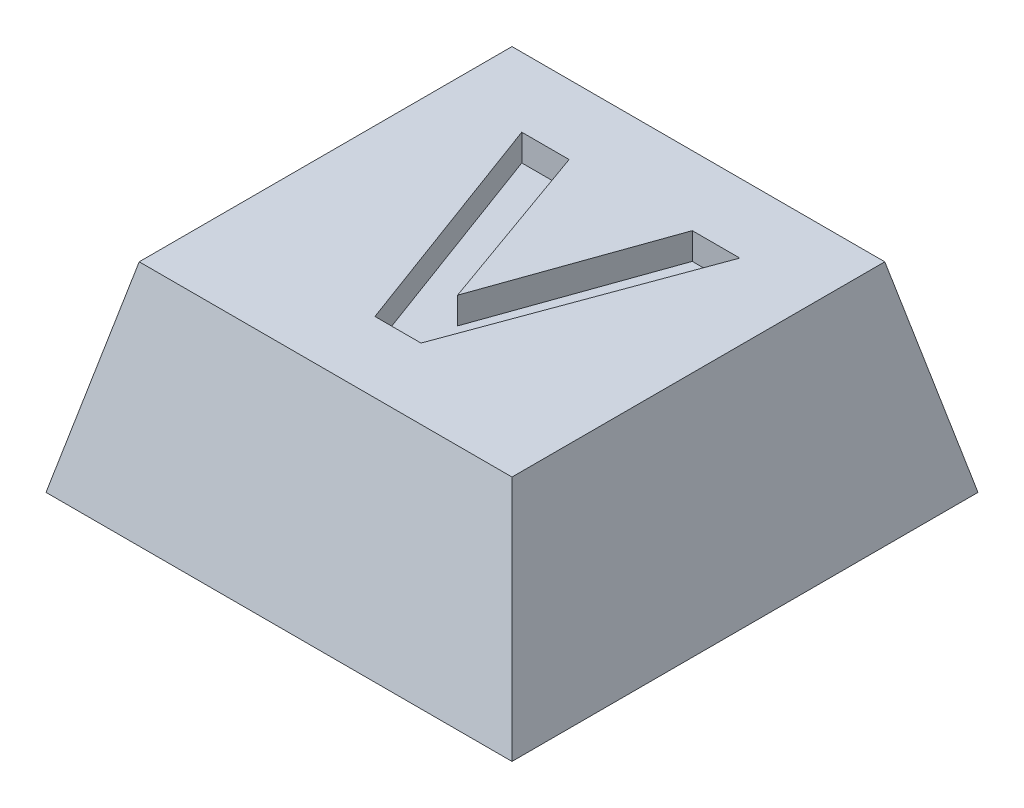
ISO-10303-21;
HEADER;
FILE_DESCRIPTION(('STEP AP214'),'2;1');
FILE_NAME('part.step','',(''),(''),'','','');
FILE_SCHEMA(('AUTOMOTIVE_DESIGN { 1 0 10303 214 1 1 1 1 }'));
ENDSEC;
DATA;
#1=APPLICATION_CONTEXT('core data for automotive mechanical design processes');
#2=APPLICATION_PROTOCOL_DEFINITION('international standard','automotive_design',2000,#1);
#3=PRODUCT_CONTEXT('',#1,'mechanical');
#4=PRODUCT('Part','Part','',(#3));
#5=PRODUCT_RELATED_PRODUCT_CATEGORY('part','',(#4));
#6=PRODUCT_DEFINITION_FORMATION('','',#4);
#7=PRODUCT_DEFINITION_CONTEXT('part definition',#1,'design');
#8=PRODUCT_DEFINITION('design','',#6,#7);
#9=PRODUCT_DEFINITION_SHAPE('','',#8);
#10=(LENGTH_UNIT() NAMED_UNIT(*) SI_UNIT(.MILLI.,.METRE.));
#11=(NAMED_UNIT(*) PLANE_ANGLE_UNIT() SI_UNIT($,.RADIAN.));
#12=(NAMED_UNIT(*) SI_UNIT($,.STERADIAN.) SOLID_ANGLE_UNIT());
#13=UNCERTAINTY_MEASURE_WITH_UNIT(LENGTH_MEASURE(1.E-05),#10,'distance_accuracy_value','');
#14=(GEOMETRIC_REPRESENTATION_CONTEXT(3) GLOBAL_UNCERTAINTY_ASSIGNED_CONTEXT((#13)) GLOBAL_UNIT_ASSIGNED_CONTEXT((#10,
#11,#12)) REPRESENTATION_CONTEXT('',''));
#15=CARTESIAN_POINT('',(0.,0.,0.));
#16=DIRECTION('',(0.,0.,1.));
#17=DIRECTION('',(1.,0.,0.));
#18=AXIS2_PLACEMENT_3D('',#15,#16,#17);
#19=CARTESIAN_POINT('',(0.,3.,0.));
#20=DIRECTION('',(0.,-1.,0.));
#21=DIRECTION('',(0.,0.,-1.));
#22=AXIS2_PLACEMENT_3D('',#19,#20,#21);
#23=PLANE('',#22);
#24=DIRECTION('',(-1.,0.,0.));
#25=VECTOR('',#24,1.);
#26=CARTESIAN_POINT('',(11.,3.,-0.7));
#27=LINE('',#26,#25);
#28=CARTESIAN_POINT('',(6.3,3.,-0.7));
#29=VERTEX_POINT('',#28);
#30=CARTESIAN_POINT('',(0.7,3.,-0.7));
#31=VERTEX_POINT('',#30);
#32=EDGE_CURVE('E65',#29,#31,#27,.T.);
#33=ORIENTED_EDGE('',*,*,#32,.F.);
#34=DIRECTION('',(0.,0.,1.));
#35=VECTOR('',#34,1.);
#36=CARTESIAN_POINT('',(6.3,3.,-7.));
#37=LINE('',#36,#35);
#38=CARTESIAN_POINT('',(6.3,3.,-6.3));
#39=VERTEX_POINT('',#38);
#40=EDGE_CURVE('E176',#39,#29,#37,.T.);
#41=ORIENTED_EDGE('',*,*,#40,.F.);
#42=DIRECTION('',(-1.,0.,0.));
#43=VECTOR('',#42,1.);
#44=CARTESIAN_POINT('',(11.,3.,-6.3));
#45=LINE('',#44,#43);
#46=CARTESIAN_POINT('',(0.699999999999998,3.,-6.3));
#47=VERTEX_POINT('',#46);
#48=EDGE_CURVE('E163',#39,#47,#45,.T.);
#49=ORIENTED_EDGE('',*,*,#48,.T.);
#50=DIRECTION('',(0.,0.,1.));
#51=VECTOR('',#50,1.);
#52=CARTESIAN_POINT('',(0.7,3.,-7.));
#53=LINE('',#52,#51);
#54=EDGE_CURVE('E177',#47,#31,#53,.T.);
#55=ORIENTED_EDGE('',*,*,#54,.T.);
#56=EDGE_LOOP('',(#33,#41,#49,#55));
#57=FACE_BOUND('',#56,.T.);
#58=DIRECTION('',(-1.,0.,0.));
#59=VECTOR('',#58,1.);
#60=CARTESIAN_POINT('',(3.87375278139367,3.,-1.75928235155919));
#61=LINE('',#60,#59);
#62=CARTESIAN_POINT('',(3.87375278139367,3.,-1.75928235155919));
#63=VERTEX_POINT('',#62);
#64=CARTESIAN_POINT('',(3.18174556985521,3.,-1.75928235155919));
#65=VERTEX_POINT('',#64);
#66=EDGE_CURVE('E58',#63,#65,#61,.T.);
#67=ORIENTED_EDGE('',*,*,#66,.T.);
#68=DIRECTION('',(-0.346837004095032,0.,-0.937925419524593));
#69=VECTOR('',#68,1.);
#70=CARTESIAN_POINT('',(3.18174556985521,3.,-1.75928235155919));
#71=LINE('',#70,#69);
#72=CARTESIAN_POINT('',(1.88747473652188,3.,-5.25928235155919));
#73=VERTEX_POINT('',#72);
#74=EDGE_CURVE('E147',#65,#73,#71,.T.);
#75=ORIENTED_EDGE('',*,*,#74,.T.);
#76=DIRECTION('',(1.,0.,0.));
#77=VECTOR('',#76,1.);
#78=CARTESIAN_POINT('',(1.88747473652188,3.,-5.25928235155919));
#79=LINE('',#78,#77);
#80=CARTESIAN_POINT('',(2.59841223652188,3.,-5.25928235155919));
#81=VERTEX_POINT('',#80);
#82=EDGE_CURVE('E427',#73,#81,#79,.T.);
#83=ORIENTED_EDGE('',*,*,#82,.T.);
#84=DIRECTION('',(0.335500275538548,0.,0.942040108017466));
#85=VECTOR('',#84,1.);
#86=CARTESIAN_POINT('',(2.59841223652188,3.,-5.25928235155919));
#87=LINE('',#86,#85);
#88=CARTESIAN_POINT('',(3.52529524934239,3.,-2.65671824899509));
#89=VERTEX_POINT('',#88);
#90=EDGE_CURVE('E408',#81,#89,#87,.T.);
#91=ORIENTED_EDGE('',*,*,#90,.T.);
#92=DIRECTION('',(0.33437347432051,0.,-0.942440650476639));
#93=VECTOR('',#92,1.);
#94=CARTESIAN_POINT('',(3.52529524934239,3.,-2.65671824899509));
#95=LINE('',#94,#93);
#96=CARTESIAN_POINT('',(4.44867265318855,3.,-5.25928235155919));
#97=VERTEX_POINT('',#96);
#98=EDGE_CURVE('E403',#89,#97,#95,.T.);
#99=ORIENTED_EDGE('',*,*,#98,.T.);
#100=DIRECTION('',(1.,0.,0.));
#101=VECTOR('',#100,1.);
#102=CARTESIAN_POINT('',(4.44867265318855,3.,-5.25928235155919));
#103=LINE('',#102,#101);
#104=CARTESIAN_POINT('',(5.1631157621629,3.,-5.25928235155919));
#105=VERTEX_POINT('',#104);
#106=EDGE_CURVE('E397',#97,#105,#103,.T.);
#107=ORIENTED_EDGE('',*,*,#106,.T.);
#108=DIRECTION('',(-0.345679226097517,0.,0.93835274425166));
#109=VECTOR('',#108,1.);
#110=CARTESIAN_POINT('',(5.1631157621629,3.,-5.25928235155919));
#111=LINE('',#110,#109);
#112=EDGE_CURVE('E143',#105,#63,#111,.T.);
#113=ORIENTED_EDGE('',*,*,#112,.T.);
#114=EDGE_LOOP('',(#67,#75,#83,#91,#99,#107,#113));
#115=FACE_BOUND('',#114,.T.);
#116=ADVANCED_FACE('F42',(#57,#115),#23,.F.);
#117=CARTESIAN_POINT('',(7.,0.,-7.));
#118=DIRECTION('',(-0.973841209741793,-0.227229615606418,0.));
#119=DIRECTION('',(0.227229615606418,-0.973841209741793,0.));
#120=AXIS2_PLACEMENT_3D('',#117,#118,#119);
#121=PLANE('',#120);
#122=DIRECTION('',(-0.221581128241521,0.949633406749377,-0.221581128241521));
#123=VECTOR('',#122,1.);
#124=CARTESIAN_POINT('',(6.6563126252505,1.47294589178357,-0.343687374749499));
#125=LINE('',#124,#123);
#126=CARTESIAN_POINT('',(7.,0.,0.));
#127=VERTEX_POINT('',#126);
#128=EDGE_CURVE('E173',#127,#29,#125,.T.);
#129=ORIENTED_EDGE('',*,*,#128,.F.);
#130=DIRECTION('',(0.,0.,-1.));
#131=VECTOR('',#130,1.);
#132=CARTESIAN_POINT('',(7.,0.,0.));
#133=LINE('',#132,#131);
#134=CARTESIAN_POINT('',(7.,0.,-7.));
#135=VERTEX_POINT('',#134);
#136=EDGE_CURVE('E191',#127,#135,#133,.T.);
#137=ORIENTED_EDGE('',*,*,#136,.T.);
#138=DIRECTION('',(0.221581128241521,-0.949633406749377,-0.221581128241521));
#139=VECTOR('',#138,1.);
#140=CARTESIAN_POINT('',(7.,0.,-7.));
#141=LINE('',#140,#139);
#142=EDGE_CURVE('E167',#39,#135,#141,.T.);
#143=ORIENTED_EDGE('',*,*,#142,.F.);
#144=ORIENTED_EDGE('',*,*,#40,.T.);
#145=EDGE_LOOP('',(#129,#137,#143,#144));
#146=FACE_BOUND('',#145,.T.);
#147=ADVANCED_FACE('F216',(#146),#121,.F.);
#148=CARTESIAN_POINT('',(0.,0.,-7.));
#149=DIRECTION('',(0.973841209741793,-0.227229615606418,0.));
#150=DIRECTION('',(0.227229615606418,0.973841209741793,0.));
#151=AXIS2_PLACEMENT_3D('',#148,#149,#150);
#152=PLANE('',#151);
#153=DIRECTION('',(-0.221581128241521,-0.949633406749378,0.221581128241521));
#154=VECTOR('',#153,1.);
#155=CARTESIAN_POINT('',(0.343687374749499,1.47294589178357,-0.3436873747495));
#156=LINE('',#155,#154);
#157=CARTESIAN_POINT('',(0.,0.,0.));
#158=VERTEX_POINT('',#157);
#159=EDGE_CURVE('E11',#31,#158,#156,.T.);
#160=ORIENTED_EDGE('',*,*,#159,.F.);
#161=ORIENTED_EDGE('',*,*,#54,.F.);
#162=DIRECTION('',(0.221581128241521,0.949633406749377,0.221581128241521));
#163=VECTOR('',#162,1.);
#164=CARTESIAN_POINT('',(0.,0.,-7.));
#165=LINE('',#164,#163);
#166=CARTESIAN_POINT('',(0.,0.,-7.));
#167=VERTEX_POINT('',#166);
#168=EDGE_CURVE('E51',#167,#47,#165,.T.);
#169=ORIENTED_EDGE('',*,*,#168,.F.);
#170=DIRECTION('',(0.,0.,1.));
#171=VECTOR('',#170,1.);
#172=CARTESIAN_POINT('',(0.,0.,0.));
#173=LINE('',#172,#171);
#174=EDGE_CURVE('E181',#167,#158,#173,.T.);
#175=ORIENTED_EDGE('',*,*,#174,.T.);
#176=EDGE_LOOP('',(#160,#161,#169,#175));
#177=FACE_BOUND('',#176,.T.);
#178=ADVANCED_FACE('F209',(#177),#152,.F.);
#179=CARTESIAN_POINT('',(0.,0.,0.));
#180=DIRECTION('',(0.,-1.,0.));
#181=DIRECTION('',(0.,0.,-1.));
#182=AXIS2_PLACEMENT_3D('',#179,#180,#181);
#183=PLANE('',#182);
#184=CARTESIAN_POINT('',(3.5,0.,-3.5));
#185=DIRECTION('',(0.,-1.,0.));
#186=DIRECTION('',(0.,0.,-1.));
#187=AXIS2_PLACEMENT_3D('',#184,#185,#186);
#188=CIRCLE('',#187,1.8);
#189=CARTESIAN_POINT('',(3.5,0.,-5.3));
#190=VERTEX_POINT('',#189);
#191=EDGE_CURVE('E149',#190,#190,#188,.T.);
#192=ORIENTED_EDGE('',*,*,#191,.F.);
#193=EDGE_LOOP('',(#192));
#194=FACE_BOUND('',#193,.T.);
#195=ORIENTED_EDGE('',*,*,#174,.F.);
#196=DIRECTION('',(-1.,0.,0.));
#197=VECTOR('',#196,1.);
#198=CARTESIAN_POINT('',(0.,0.,-7.));
#199=LINE('',#198,#197);
#200=EDGE_CURVE('E195',#135,#167,#199,.T.);
#201=ORIENTED_EDGE('',*,*,#200,.F.);
#202=ORIENTED_EDGE('',*,*,#136,.F.);
#203=DIRECTION('',(1.,0.,0.));
#204=VECTOR('',#203,1.);
#205=CARTESIAN_POINT('',(0.,0.,0.));
#206=LINE('',#205,#204);
#207=EDGE_CURVE('E188',#158,#127,#206,.T.);
#208=ORIENTED_EDGE('',*,*,#207,.F.);
#209=EDGE_LOOP('',(#195,#201,#202,#208));
#210=FACE_BOUND('',#209,.T.);
#211=ADVANCED_FACE('F44',(#194,#210),#183,.T.);
#212=CARTESIAN_POINT('',(11.,3.,-6.3));
#213=DIRECTION('',(0.,0.227229615606418,-0.973841209741793));
#214=DIRECTION('',(0.,0.973841209741793,0.227229615606418));
#215=AXIS2_PLACEMENT_3D('',#212,#213,#214);
#216=PLANE('',#215);
#217=ORIENTED_EDGE('',*,*,#142,.T.);
#218=ORIENTED_EDGE('',*,*,#200,.T.);
#219=ORIENTED_EDGE('',*,*,#168,.T.);
#220=ORIENTED_EDGE('',*,*,#48,.F.);
#221=EDGE_LOOP('',(#217,#218,#219,#220));
#222=FACE_BOUND('',#221,.T.);
#223=ADVANCED_FACE('F200',(#222),#216,.T.);
#224=CARTESIAN_POINT('',(11.,0.,0.));
#225=DIRECTION('',(0.,0.227229615606418,0.973841209741793));
#226=DIRECTION('',(0.,-0.973841209741793,0.227229615606418));
#227=AXIS2_PLACEMENT_3D('',#224,#225,#226);
#228=PLANE('',#227);
#229=ORIENTED_EDGE('',*,*,#128,.T.);
#230=ORIENTED_EDGE('',*,*,#32,.T.);
#231=ORIENTED_EDGE('',*,*,#159,.T.);
#232=ORIENTED_EDGE('',*,*,#207,.T.);
#233=EDGE_LOOP('',(#229,#230,#231,#232));
#234=FACE_BOUND('',#233,.T.);
#235=ADVANCED_FACE('F211',(#234),#228,.T.);
#236=CARTESIAN_POINT('',(3.5,0.8,-3.5));
#237=DIRECTION('',(0.,-1.,0.));
#238=DIRECTION('',(0.,0.,-1.));
#239=AXIS2_PLACEMENT_3D('',#236,#237,#238);
#240=CYLINDRICAL_SURFACE('',#239,1.8);
#241=CARTESIAN_POINT('',(3.5,0.8,-3.5));
#242=DIRECTION('',(0.,-1.,0.));
#243=DIRECTION('',(0.,0.,-1.));
#244=AXIS2_PLACEMENT_3D('',#241,#242,#243);
#245=CIRCLE('',#244,1.8);
#246=CARTESIAN_POINT('',(3.5,0.8,-5.3));
#247=VERTEX_POINT('',#246);
#248=EDGE_CURVE('E155',#247,#247,#245,.T.);
#249=ORIENTED_EDGE('',*,*,#248,.F.);
#250=EDGE_LOOP('',(#249));
#251=FACE_BOUND('',#250,.T.);
#252=ORIENTED_EDGE('',*,*,#191,.T.);
#253=EDGE_LOOP('',(#252));
#254=FACE_BOUND('',#253,.T.);
#255=ADVANCED_FACE('F236',(#251,#254),#240,.F.);
#256=CARTESIAN_POINT('',(3.5,0.8,-3.5));
#257=DIRECTION('',(0.,-1.,0.));
#258=DIRECTION('',(0.,0.,-1.));
#259=AXIS2_PLACEMENT_3D('',#256,#257,#258);
#260=PLANE('',#259);
#261=ORIENTED_EDGE('',*,*,#248,.T.);
#262=EDGE_LOOP('',(#261));
#263=FACE_BOUND('',#262,.T.);
#264=ADVANCED_FACE('F239',(#263),#260,.T.);
#265=CARTESIAN_POINT('',(3.87375278139367,2.6,-1.75928235155919));
#266=DIRECTION('',(0.,0.,-1.));
#267=DIRECTION('',(-1.,0.,0.));
#268=AXIS2_PLACEMENT_3D('',#265,#266,#267);
#269=PLANE('',#268);
#270=ORIENTED_EDGE('',*,*,#66,.F.);
#271=DIRECTION('',(0.,1.,0.));
#272=VECTOR('',#271,1.);
#273=CARTESIAN_POINT('',(3.87375278139367,2.6,-1.75928235155919));
#274=LINE('',#273,#272);
#275=CARTESIAN_POINT('',(3.87375278139367,2.6,-1.75928235155919));
#276=VERTEX_POINT('',#275);
#277=EDGE_CURVE('E141',#276,#63,#274,.T.);
#278=ORIENTED_EDGE('',*,*,#277,.F.);
#279=DIRECTION('',(-1.,0.,0.));
#280=VECTOR('',#279,1.);
#281=CARTESIAN_POINT('',(3.87375278139367,2.6,-1.75928235155919));
#282=LINE('',#281,#280);
#283=CARTESIAN_POINT('',(3.18174556985521,2.6,-1.75928235155919));
#284=VERTEX_POINT('',#283);
#285=EDGE_CURVE('E131',#276,#284,#282,.T.);
#286=ORIENTED_EDGE('',*,*,#285,.T.);
#287=DIRECTION('',(0.,1.,0.));
#288=VECTOR('',#287,1.);
#289=CARTESIAN_POINT('',(3.18174556985521,2.6,-1.75928235155919));
#290=LINE('',#289,#288);
#291=EDGE_CURVE('E140',#284,#65,#290,.T.);
#292=ORIENTED_EDGE('',*,*,#291,.T.);
#293=EDGE_LOOP('',(#270,#278,#286,#292));
#294=FACE_BOUND('',#293,.T.);
#295=ADVANCED_FACE('F139',(#294),#269,.T.);
#296=CARTESIAN_POINT('',(3.18174556985521,2.6,-1.75928235155919));
#297=DIRECTION('',(0.937925419524593,0.,-0.346837004095032));
#298=DIRECTION('',(-0.346837004095032,0.,-0.937925419524593));
#299=AXIS2_PLACEMENT_3D('',#296,#297,#298);
#300=PLANE('',#299);
#301=ORIENTED_EDGE('',*,*,#74,.F.);
#302=ORIENTED_EDGE('',*,*,#291,.F.);
#303=DIRECTION('',(-0.346837004095032,0.,-0.937925419524593));
#304=VECTOR('',#303,1.);
#305=CARTESIAN_POINT('',(3.18174556985521,2.6,-1.75928235155919));
#306=LINE('',#305,#304);
#307=CARTESIAN_POINT('',(1.88747473652188,2.6,-5.25928235155919));
#308=VERTEX_POINT('',#307);
#309=EDGE_CURVE('E127',#284,#308,#306,.T.);
#310=ORIENTED_EDGE('',*,*,#309,.T.);
#311=DIRECTION('',(0.,1.,0.));
#312=VECTOR('',#311,1.);
#313=CARTESIAN_POINT('',(1.88747473652188,2.6,-5.25928235155919));
#314=LINE('',#313,#312);
#315=EDGE_CURVE('E150',#308,#73,#314,.T.);
#316=ORIENTED_EDGE('',*,*,#315,.T.);
#317=EDGE_LOOP('',(#301,#302,#310,#316));
#318=FACE_BOUND('',#317,.T.);
#319=ADVANCED_FACE('F145',(#318),#300,.T.);
#320=CARTESIAN_POINT('',(1.88747473652188,2.6,-5.25928235155919));
#321=DIRECTION('',(0.,0.,1.));
#322=DIRECTION('',(1.,0.,0.));
#323=AXIS2_PLACEMENT_3D('',#320,#321,#322);
#324=PLANE('',#323);
#325=ORIENTED_EDGE('',*,*,#82,.F.);
#326=ORIENTED_EDGE('',*,*,#315,.F.);
#327=DIRECTION('',(1.,0.,0.));
#328=VECTOR('',#327,1.);
#329=CARTESIAN_POINT('',(1.88747473652188,2.6,-5.25928235155919));
#330=LINE('',#329,#328);
#331=CARTESIAN_POINT('',(2.59841223652188,2.6,-5.25928235155919));
#332=VERTEX_POINT('',#331);
#333=EDGE_CURVE('E133',#308,#332,#330,.T.);
#334=ORIENTED_EDGE('',*,*,#333,.T.);
#335=DIRECTION('',(0.,1.,0.));
#336=VECTOR('',#335,1.);
#337=CARTESIAN_POINT('',(2.59841223652188,2.6,-5.25928235155919));
#338=LINE('',#337,#336);
#339=EDGE_CURVE('E157',#332,#81,#338,.T.);
#340=ORIENTED_EDGE('',*,*,#339,.T.);
#341=EDGE_LOOP('',(#325,#326,#334,#340));
#342=FACE_BOUND('',#341,.T.);
#343=ADVANCED_FACE('F248',(#342),#324,.T.);
#344=CARTESIAN_POINT('',(2.59841223652188,2.6,-5.25928235155919));
#345=DIRECTION('',(-0.942040108017466,0.,0.335500275538548));
#346=DIRECTION('',(0.335500275538548,0.,0.942040108017466));
#347=AXIS2_PLACEMENT_3D('',#344,#345,#346);
#348=PLANE('',#347);
#349=ORIENTED_EDGE('',*,*,#90,.F.);
#350=ORIENTED_EDGE('',*,*,#339,.F.);
#351=DIRECTION('',(0.335500275538548,0.,0.942040108017466));
#352=VECTOR('',#351,1.);
#353=CARTESIAN_POINT('',(2.59841223652188,2.6,-5.25928235155919));
#354=LINE('',#353,#352);
#355=CARTESIAN_POINT('',(3.52529524934239,2.6,-2.65671824899509));
#356=VERTEX_POINT('',#355);
#357=EDGE_CURVE('E445',#332,#356,#354,.T.);
#358=ORIENTED_EDGE('',*,*,#357,.T.);
#359=DIRECTION('',(0.,1.,0.));
#360=VECTOR('',#359,1.);
#361=CARTESIAN_POINT('',(3.52529524934239,2.6,-2.65671824899509));
#362=LINE('',#361,#360);
#363=EDGE_CURVE('E420',#356,#89,#362,.T.);
#364=ORIENTED_EDGE('',*,*,#363,.T.);
#365=EDGE_LOOP('',(#349,#350,#358,#364));
#366=FACE_BOUND('',#365,.T.);
#367=ADVANCED_FACE('F251',(#366),#348,.T.);
#368=CARTESIAN_POINT('',(3.52529524934239,2.6,-2.65671824899509));
#369=DIRECTION('',(0.942440650476639,0.,0.33437347432051));
#370=DIRECTION('',(0.33437347432051,0.,-0.942440650476639));
#371=AXIS2_PLACEMENT_3D('',#368,#369,#370);
#372=PLANE('',#371);
#373=ORIENTED_EDGE('',*,*,#98,.F.);
#374=ORIENTED_EDGE('',*,*,#363,.F.);
#375=DIRECTION('',(0.33437347432051,0.,-0.942440650476639));
#376=VECTOR('',#375,1.);
#377=CARTESIAN_POINT('',(3.52529524934239,2.6,-2.65671824899509));
#378=LINE('',#377,#376);
#379=CARTESIAN_POINT('',(4.44867265318855,2.6,-5.25928235155919));
#380=VERTEX_POINT('',#379);
#381=EDGE_CURVE('E442',#356,#380,#378,.T.);
#382=ORIENTED_EDGE('',*,*,#381,.T.);
#383=DIRECTION('',(0.,1.,0.));
#384=VECTOR('',#383,1.);
#385=CARTESIAN_POINT('',(4.44867265318855,2.6,-5.25928235155919));
#386=LINE('',#385,#384);
#387=EDGE_CURVE('E417',#380,#97,#386,.T.);
#388=ORIENTED_EDGE('',*,*,#387,.T.);
#389=EDGE_LOOP('',(#373,#374,#382,#388));
#390=FACE_BOUND('',#389,.T.);
#391=ADVANCED_FACE('F255',(#390),#372,.T.);
#392=CARTESIAN_POINT('',(4.44867265318855,2.6,-5.25928235155919));
#393=DIRECTION('',(0.,0.,1.));
#394=DIRECTION('',(1.,0.,0.));
#395=AXIS2_PLACEMENT_3D('',#392,#393,#394);
#396=PLANE('',#395);
#397=ORIENTED_EDGE('',*,*,#106,.F.);
#398=ORIENTED_EDGE('',*,*,#387,.F.);
#399=DIRECTION('',(1.,0.,0.));
#400=VECTOR('',#399,1.);
#401=CARTESIAN_POINT('',(4.44867265318855,2.6,-5.25928235155919));
#402=LINE('',#401,#400);
#403=CARTESIAN_POINT('',(5.1631157621629,2.6,-5.25928235155919));
#404=VERTEX_POINT('',#403);
#405=EDGE_CURVE('E439',#380,#404,#402,.T.);
#406=ORIENTED_EDGE('',*,*,#405,.T.);
#407=DIRECTION('',(0.,1.,0.));
#408=VECTOR('',#407,1.);
#409=CARTESIAN_POINT('',(5.1631157621629,2.6,-5.25928235155919));
#410=LINE('',#409,#408);
#411=EDGE_CURVE('E395',#404,#105,#410,.T.);
#412=ORIENTED_EDGE('',*,*,#411,.T.);
#413=EDGE_LOOP('',(#397,#398,#406,#412));
#414=FACE_BOUND('',#413,.T.);
#415=ADVANCED_FACE('F259',(#414),#396,.T.);
#416=CARTESIAN_POINT('',(5.1631157621629,2.6,-5.25928235155919));
#417=DIRECTION('',(-0.93835274425166,0.,-0.345679226097517));
#418=DIRECTION('',(-0.345679226097517,0.,0.93835274425166));
#419=AXIS2_PLACEMENT_3D('',#416,#417,#418);
#420=PLANE('',#419);
#421=ORIENTED_EDGE('',*,*,#112,.F.);
#422=ORIENTED_EDGE('',*,*,#411,.F.);
#423=DIRECTION('',(-0.345679226097517,0.,0.93835274425166));
#424=VECTOR('',#423,1.);
#425=CARTESIAN_POINT('',(5.1631157621629,2.6,-5.25928235155919));
#426=LINE('',#425,#424);
#427=EDGE_CURVE('E414',#404,#276,#426,.T.);
#428=ORIENTED_EDGE('',*,*,#427,.T.);
#429=ORIENTED_EDGE('',*,*,#277,.T.);
#430=EDGE_LOOP('',(#421,#422,#428,#429));
#431=FACE_BOUND('',#430,.T.);
#432=ADVANCED_FACE('F263',(#431),#420,.T.);
#433=CARTESIAN_POINT('',(0.,2.6,0.));
#434=DIRECTION('',(0.,-1.,0.));
#435=DIRECTION('',(0.,0.,-1.));
#436=AXIS2_PLACEMENT_3D('',#433,#434,#435);
#437=PLANE('',#436);
#438=ORIENTED_EDGE('',*,*,#285,.F.);
#439=ORIENTED_EDGE('',*,*,#427,.F.);
#440=ORIENTED_EDGE('',*,*,#405,.F.);
#441=ORIENTED_EDGE('',*,*,#381,.F.);
#442=ORIENTED_EDGE('',*,*,#357,.F.);
#443=ORIENTED_EDGE('',*,*,#333,.F.);
#444=ORIENTED_EDGE('',*,*,#309,.F.);
#445=EDGE_LOOP('',(#438,#439,#440,#441,#442,#443,#444));
#446=FACE_BOUND('',#445,.T.);
#447=ADVANCED_FACE('F129',(#446),#437,.F.);
#448=CLOSED_SHELL('',(#116,#147,#178,#211,#223,#235,#255,#264,#295,#319,#343,#367,#391,#415,
#432,#447));
#449=MANIFOLD_SOLID_BREP('B2',#448);
#450=ADVANCED_BREP_SHAPE_REPRESENTATION('',(#18,#449),#14);
#451=SHAPE_DEFINITION_REPRESENTATION(#9,#450);
ENDSEC;
END-ISO-10303-21;
